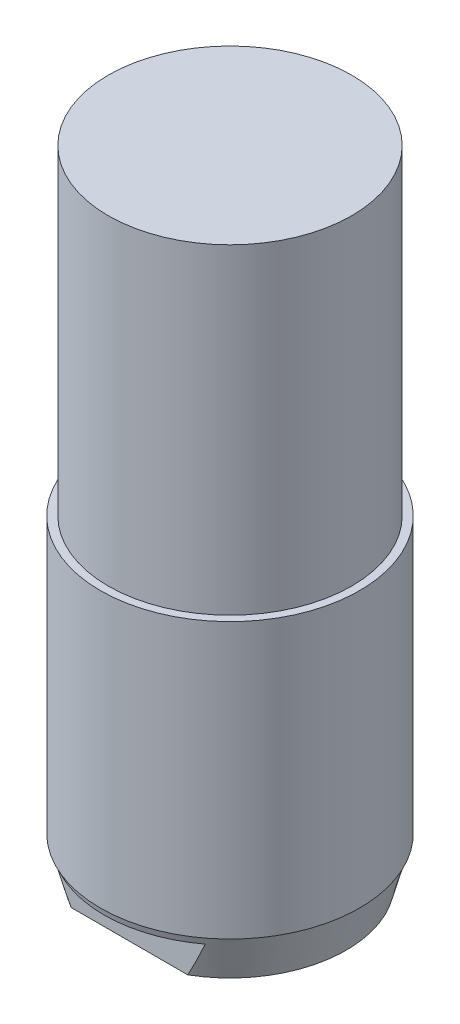
ISO-10303-21;
HEADER;
FILE_DESCRIPTION(('STEP AP214'),'2;1');
FILE_NAME('part.step','',(''),(''),'','','');
FILE_SCHEMA(('AUTOMOTIVE_DESIGN { 1 0 10303 214 1 1 1 1 }'));
ENDSEC;
DATA;
#1=APPLICATION_CONTEXT('core data for automotive mechanical design processes');
#2=APPLICATION_PROTOCOL_DEFINITION('international standard','automotive_design',2000,#1);
#3=PRODUCT_CONTEXT('',#1,'mechanical');
#4=PRODUCT('Part','Part','',(#3));
#5=PRODUCT_RELATED_PRODUCT_CATEGORY('part','',(#4));
#6=PRODUCT_DEFINITION_FORMATION('','',#4);
#7=PRODUCT_DEFINITION_CONTEXT('part definition',#1,'design');
#8=PRODUCT_DEFINITION('design','',#6,#7);
#9=PRODUCT_DEFINITION_SHAPE('','',#8);
#10=(LENGTH_UNIT() NAMED_UNIT(*) SI_UNIT(.MILLI.,.METRE.));
#11=(NAMED_UNIT(*) PLANE_ANGLE_UNIT() SI_UNIT($,.RADIAN.));
#12=(NAMED_UNIT(*) SI_UNIT($,.STERADIAN.) SOLID_ANGLE_UNIT());
#13=UNCERTAINTY_MEASURE_WITH_UNIT(LENGTH_MEASURE(1.E-05),#10,'distance_accuracy_value','');
#14=(GEOMETRIC_REPRESENTATION_CONTEXT(3) GLOBAL_UNCERTAINTY_ASSIGNED_CONTEXT((#13)) GLOBAL_UNIT_ASSIGNED_CONTEXT((#10,
#11,#12)) REPRESENTATION_CONTEXT('',''));
#15=CARTESIAN_POINT('',(0.,0.,0.));
#16=DIRECTION('',(0.,0.,1.));
#17=DIRECTION('',(1.,0.,0.));
#18=AXIS2_PLACEMENT_3D('',#15,#16,#17);
#19=CARTESIAN_POINT('',(0.,1.55,0.));
#20=DIRECTION('',(0.,1.,0.));
#21=DIRECTION('',(0.,0.,1.));
#22=AXIS2_PLACEMENT_3D('',#19,#20,#21);
#23=CYLINDRICAL_SURFACE('',#22,6.5);
#24=CARTESIAN_POINT('',(0.,1.3,0.));
#25=DIRECTION('',(0.,1.,0.));
#26=DIRECTION('',(1.,0.,0.));
#27=AXIS2_PLACEMENT_3D('',#24,#25,#26);
#28=CIRCLE('',#27,6.5);
#29=CARTESIAN_POINT('',(0.,1.3,6.5));
#30=VERTEX_POINT('',#29);
#31=CARTESIAN_POINT('',(0.,1.3,-6.5));
#32=VERTEX_POINT('',#31);
#33=EDGE_CURVE('E212',#30,#32,#28,.T.);
#34=ORIENTED_EDGE('',*,*,#33,.F.);
#35=CARTESIAN_POINT('',(0.,1.3,0.));
#36=DIRECTION('',(0.,1.,0.));
#37=DIRECTION('',(1.,0.,0.));
#38=AXIS2_PLACEMENT_3D('',#35,#36,#37);
#39=CIRCLE('',#38,6.5);
#40=EDGE_CURVE('E238',#32,#30,#39,.T.);
#41=ORIENTED_EDGE('',*,*,#40,.F.);
#42=DIRECTION('',(0.,1.,0.));
#43=VECTOR('',#42,1.);
#44=CARTESIAN_POINT('',(0.,1.55,-6.5));
#45=LINE('',#44,#43);
#46=CARTESIAN_POINT('',(0.,1.8,-6.5));
#47=VERTEX_POINT('',#46);
#48=EDGE_CURVE('E11',#32,#47,#45,.T.);
#49=ORIENTED_EDGE('',*,*,#48,.T.);
#50=CARTESIAN_POINT('',(0.,1.8,0.));
#51=DIRECTION('',(0.,1.,0.));
#52=DIRECTION('',(1.,0.,0.));
#53=AXIS2_PLACEMENT_3D('',#50,#51,#52);
#54=CIRCLE('',#53,6.5);
#55=CARTESIAN_POINT('',(0.,1.8,6.5));
#56=VERTEX_POINT('',#55);
#57=EDGE_CURVE('E184',#47,#56,#54,.T.);
#58=ORIENTED_EDGE('',*,*,#57,.T.);
#59=CARTESIAN_POINT('',(0.,1.8,0.));
#60=DIRECTION('',(0.,1.,0.));
#61=DIRECTION('',(1.,0.,0.));
#62=AXIS2_PLACEMENT_3D('',#59,#60,#61);
#63=CIRCLE('',#62,6.5);
#64=EDGE_CURVE('E177',#56,#47,#63,.T.);
#65=ORIENTED_EDGE('',*,*,#64,.T.);
#66=ORIENTED_EDGE('',*,*,#48,.F.);
#67=EDGE_LOOP('',(#34,#41,#49,#58,#65,#66));
#68=FACE_BOUND('',#67,.T.);
#69=ADVANCED_FACE('F53',(#68),#23,.F.);
#70=CARTESIAN_POINT('',(0.,0.9,0.));
#71=DIRECTION('',(0.,1.,0.));
#72=DIRECTION('',(0.,0.,1.));
#73=AXIS2_PLACEMENT_3D('',#70,#71,#72);
#74=CONICAL_SURFACE('',#73,5.75,0.694738276196703);
#75=ORIENTED_EDGE('',*,*,#64,.F.);
#76=ORIENTED_EDGE('',*,*,#57,.F.);
#77=DIRECTION('',(0.,-0.768221279597376,0.64018439966448));
#78=VECTOR('',#77,1.);
#79=CARTESIAN_POINT('',(0.,0.9,-5.75));
#80=LINE('',#79,#78);
#81=CARTESIAN_POINT('',(0.,0.,-5.));
#82=VERTEX_POINT('',#81);
#83=EDGE_CURVE('E62',#47,#82,#80,.T.);
#84=ORIENTED_EDGE('',*,*,#83,.T.);
#85=CARTESIAN_POINT('',(0.,0.,0.));
#86=DIRECTION('',(0.,1.,0.));
#87=DIRECTION('',(1.,0.,0.));
#88=AXIS2_PLACEMENT_3D('',#85,#86,#87);
#89=CIRCLE('',#88,5.);
#90=CARTESIAN_POINT('',(-5.,0.,0.));
#91=VERTEX_POINT('',#90);
#92=EDGE_CURVE('E234',#82,#91,#89,.T.);
#93=ORIENTED_EDGE('',*,*,#92,.T.);
#94=CARTESIAN_POINT('',(0.,0.,0.));
#95=DIRECTION('',(0.,1.,0.));
#96=DIRECTION('',(1.,0.,0.));
#97=AXIS2_PLACEMENT_3D('',#94,#95,#96);
#98=CIRCLE('',#97,5.);
#99=CARTESIAN_POINT('',(0.,0.,5.));
#100=VERTEX_POINT('',#99);
#101=EDGE_CURVE('E205',#91,#100,#98,.T.);
#102=ORIENTED_EDGE('',*,*,#101,.T.);
#103=CARTESIAN_POINT('',(0.,0.,0.));
#104=DIRECTION('',(0.,1.,0.));
#105=DIRECTION('',(1.,0.,0.));
#106=AXIS2_PLACEMENT_3D('',#103,#104,#105);
#107=CIRCLE('',#106,5.);
#108=EDGE_CURVE('E201',#100,#82,#107,.T.);
#109=ORIENTED_EDGE('',*,*,#108,.T.);
#110=ORIENTED_EDGE('',*,*,#83,.F.);
#111=EDGE_LOOP('',(#75,#76,#84,#93,#102,#109,#110));
#112=FACE_BOUND('',#111,.T.);
#113=ADVANCED_FACE('F411',(#112),#74,.T.);
#114=CARTESIAN_POINT('',(0.,44.3,0.));
#115=DIRECTION('',(0.,1.,0.));
#116=DIRECTION('',(0.,0.,1.));
#117=AXIS2_PLACEMENT_3D('',#114,#115,#116);
#118=CYLINDRICAL_SURFACE('',#117,15.5);
#119=DIRECTION('',(0.,-1.,0.));
#120=VECTOR('',#119,1.);
#121=CARTESIAN_POINT('',(0.,44.3,-15.5));
#122=LINE('',#121,#120);
#123=CARTESIAN_POINT('',(0.,44.5350761789598,-15.5));
#124=VERTEX_POINT('',#123);
#125=CARTESIAN_POINT('',(0.,41.8,-15.5));
#126=VERTEX_POINT('',#125);
#127=EDGE_CURVE('E170',#124,#126,#122,.T.);
#128=ORIENTED_EDGE('',*,*,#127,.F.);
#129=ORIENTED_EDGE('',*,*,#127,.T.);
#130=CARTESIAN_POINT('',(0.,41.8,0.));
#131=DIRECTION('',(0.,1.,0.));
#132=DIRECTION('',(1.,0.,0.));
#133=AXIS2_PLACEMENT_3D('',#130,#131,#132);
#134=CIRCLE('',#133,15.5);
#135=CARTESIAN_POINT('',(0.,41.8,15.5));
#136=VERTEX_POINT('',#135);
#137=EDGE_CURVE('E178',#126,#136,#134,.T.);
#138=ORIENTED_EDGE('',*,*,#137,.T.);
#139=CARTESIAN_POINT('',(0.,41.8,0.));
#140=DIRECTION('',(0.,1.,0.));
#141=DIRECTION('',(1.,0.,0.));
#142=AXIS2_PLACEMENT_3D('',#139,#140,#141);
#143=CIRCLE('',#142,15.5);
#144=EDGE_CURVE('E175',#136,#126,#143,.T.);
#145=ORIENTED_EDGE('',*,*,#144,.T.);
#146=EDGE_LOOP('',(#128,#129,#138,#145));
#147=FACE_BOUND('',#146,.T.);
#148=CARTESIAN_POINT('',(0.,82.6350761789598,0.));
#149=DIRECTION('',(0.,1.,0.));
#150=DIRECTION('',(0.,0.,1.));
#151=AXIS2_PLACEMENT_3D('',#148,#149,#150);
#152=CIRCLE('',#151,15.5);
#153=CARTESIAN_POINT('',(0.,82.6350761789598,15.5));
#154=VERTEX_POINT('',#153);
#155=EDGE_CURVE('E200',#154,#154,#152,.T.);
#156=ORIENTED_EDGE('',*,*,#155,.F.);
#157=EDGE_LOOP('',(#156));
#158=FACE_BOUND('',#157,.T.);
#159=ADVANCED_FACE('F171',(#147,#158),#118,.T.);
#160=CARTESIAN_POINT('',(0.,41.8,15.5));
#161=DIRECTION('',(0.,1.,0.));
#162=DIRECTION('',(1.,0.,0.));
#163=AXIS2_PLACEMENT_3D('',#160,#161,#162);
#164=PLANE('',#163);
#165=ORIENTED_EDGE('',*,*,#144,.F.);
#166=ORIENTED_EDGE('',*,*,#137,.F.);
#167=EDGE_LOOP('',(#165,#166));
#168=FACE_BOUND('',#167,.T.);
#169=CARTESIAN_POINT('',(0.,41.8,0.));
#170=DIRECTION('',(0.,1.,0.));
#171=DIRECTION('',(1.,0.,0.));
#172=AXIS2_PLACEMENT_3D('',#169,#170,#171);
#173=CIRCLE('',#172,16.5);
#174=CARTESIAN_POINT('',(0.,41.8,16.5));
#175=VERTEX_POINT('',#174);
#176=CARTESIAN_POINT('',(0.,41.8,-16.5));
#177=VERTEX_POINT('',#176);
#178=EDGE_CURVE('E223',#175,#177,#173,.T.);
#179=ORIENTED_EDGE('',*,*,#178,.T.);
#180=CARTESIAN_POINT('',(0.,41.8,0.));
#181=DIRECTION('',(0.,1.,0.));
#182=DIRECTION('',(1.,0.,0.));
#183=AXIS2_PLACEMENT_3D('',#180,#181,#182);
#184=CIRCLE('',#183,16.5);
#185=EDGE_CURVE('E311',#177,#175,#184,.T.);
#186=ORIENTED_EDGE('',*,*,#185,.T.);
#187=EDGE_LOOP('',(#179,#186));
#188=FACE_BOUND('',#187,.T.);
#189=ADVANCED_FACE('F410',(#168,#188),#164,.T.);
#190=CARTESIAN_POINT('',(0.,24.3,0.));
#191=DIRECTION('',(0.,1.,0.));
#192=DIRECTION('',(0.,0.,1.));
#193=AXIS2_PLACEMENT_3D('',#190,#191,#192);
#194=CYLINDRICAL_SURFACE('',#193,16.5);
#195=ORIENTED_EDGE('',*,*,#178,.F.);
#196=ORIENTED_EDGE('',*,*,#185,.F.);
#197=DIRECTION('',(0.,-1.,0.));
#198=VECTOR('',#197,1.);
#199=CARTESIAN_POINT('',(0.,24.3,-16.5));
#200=LINE('',#199,#198);
#201=CARTESIAN_POINT('',(0.,6.8,-16.5));
#202=VERTEX_POINT('',#201);
#203=EDGE_CURVE('E314',#177,#202,#200,.T.);
#204=ORIENTED_EDGE('',*,*,#203,.T.);
#205=CARTESIAN_POINT('',(0.,6.8,0.));
#206=DIRECTION('',(0.,1.,0.));
#207=DIRECTION('',(1.,0.,0.));
#208=AXIS2_PLACEMENT_3D('',#205,#206,#207);
#209=CIRCLE('',#208,16.5);
#210=CARTESIAN_POINT('',(0.,6.8,16.5));
#211=VERTEX_POINT('',#210);
#212=EDGE_CURVE('E220',#202,#211,#209,.T.);
#213=ORIENTED_EDGE('',*,*,#212,.T.);
#214=CARTESIAN_POINT('',(0.,6.8,0.));
#215=DIRECTION('',(0.,1.,0.));
#216=DIRECTION('',(1.,0.,0.));
#217=AXIS2_PLACEMENT_3D('',#214,#215,#216);
#218=CIRCLE('',#217,16.5);
#219=EDGE_CURVE('E224',#211,#202,#218,.T.);
#220=ORIENTED_EDGE('',*,*,#219,.T.);
#221=ORIENTED_EDGE('',*,*,#203,.F.);
#222=EDGE_LOOP('',(#195,#196,#204,#213,#220,#221));
#223=FACE_BOUND('',#222,.T.);
#224=ADVANCED_FACE('F418',(#223),#194,.T.);
#225=CARTESIAN_POINT('',(0.,6.8,16.5));
#226=DIRECTION('',(0.,-1.,0.));
#227=DIRECTION('',(0.,0.,-1.));
#228=AXIS2_PLACEMENT_3D('',#225,#226,#227);
#229=PLANE('',#228);
#230=CARTESIAN_POINT('',(0.,6.8,0.));
#231=DIRECTION('',(0.,1.,0.));
#232=DIRECTION('',(1.,0.,0.));
#233=AXIS2_PLACEMENT_3D('',#230,#231,#232);
#234=CIRCLE('',#233,16.3);
#235=CARTESIAN_POINT('',(0.,6.8,16.3));
#236=VERTEX_POINT('',#235);
#237=CARTESIAN_POINT('',(0.,6.8,-16.3));
#238=VERTEX_POINT('',#237);
#239=EDGE_CURVE('E276',#236,#238,#234,.T.);
#240=ORIENTED_EDGE('',*,*,#239,.T.);
#241=CARTESIAN_POINT('',(0.,6.8,0.));
#242=DIRECTION('',(0.,1.,0.));
#243=DIRECTION('',(1.,0.,0.));
#244=AXIS2_PLACEMENT_3D('',#241,#242,#243);
#245=CIRCLE('',#244,16.3);
#246=EDGE_CURVE('E283',#238,#236,#245,.T.);
#247=ORIENTED_EDGE('',*,*,#246,.T.);
#248=EDGE_LOOP('',(#240,#247));
#249=FACE_BOUND('',#248,.T.);
#250=ORIENTED_EDGE('',*,*,#219,.F.);
#251=ORIENTED_EDGE('',*,*,#212,.F.);
#252=EDGE_LOOP('',(#250,#251));
#253=FACE_BOUND('',#252,.T.);
#254=ADVANCED_FACE('F432',(#249,#253),#229,.T.);
#255=CARTESIAN_POINT('',(0.,1.3,14.8));
#256=DIRECTION('',(0.,-1.,0.));
#257=DIRECTION('',(0.,0.,-1.));
#258=AXIS2_PLACEMENT_3D('',#255,#256,#257);
#259=PLANE('',#258);
#260=ORIENTED_EDGE('',*,*,#33,.T.);
#261=ORIENTED_EDGE('',*,*,#40,.T.);
#262=EDGE_LOOP('',(#260,#261));
#263=FACE_BOUND('',#262,.T.);
#264=DIRECTION('',(1.,0.,0.));
#265=VECTOR('',#264,1.);
#266=CARTESIAN_POINT('',(11.7126219535445,1.3,-12.8));
#267=LINE('',#266,#265);
#268=CARTESIAN_POINT('',(-7.42967024840269,1.3,-12.8));
#269=VERTEX_POINT('',#268);
#270=CARTESIAN_POINT('',(7.42967024840269,1.3,-12.8));
#271=VERTEX_POINT('',#270);
#272=EDGE_CURVE('E252',#269,#271,#267,.T.);
#273=ORIENTED_EDGE('',*,*,#272,.T.);
#274=CARTESIAN_POINT('',(0.,1.3,0.));
#275=DIRECTION('',(0.,1.,0.));
#276=DIRECTION('',(1.,0.,0.));
#277=AXIS2_PLACEMENT_3D('',#274,#275,#276);
#278=CIRCLE('',#277,14.8);
#279=CARTESIAN_POINT('',(7.42967024840268,1.3,12.8));
#280=VERTEX_POINT('',#279);
#281=EDGE_CURVE('E266',#280,#271,#278,.T.);
#282=ORIENTED_EDGE('',*,*,#281,.F.);
#283=DIRECTION('',(-1.,0.,0.));
#284=VECTOR('',#283,1.);
#285=CARTESIAN_POINT('',(11.7126219535445,1.3,12.8));
#286=LINE('',#285,#284);
#287=CARTESIAN_POINT('',(-7.42967024840268,1.3,12.8));
#288=VERTEX_POINT('',#287);
#289=EDGE_CURVE('E209',#280,#288,#286,.T.);
#290=ORIENTED_EDGE('',*,*,#289,.T.);
#291=CARTESIAN_POINT('',(0.,1.3,0.));
#292=DIRECTION('',(0.,1.,0.));
#293=DIRECTION('',(1.,0.,0.));
#294=AXIS2_PLACEMENT_3D('',#291,#292,#293);
#295=CIRCLE('',#294,14.8);
#296=EDGE_CURVE('E225',#269,#288,#295,.T.);
#297=ORIENTED_EDGE('',*,*,#296,.F.);
#298=EDGE_LOOP('',(#273,#282,#290,#297));
#299=FACE_BOUND('',#298,.T.);
#300=ADVANCED_FACE('F428',(#263,#299),#259,.T.);
#301=CARTESIAN_POINT('',(23.4252439070891,1.3,12.8));
#302=DIRECTION('',(0.,0.,-1.));
#303=DIRECTION('',(0.,-1.,0.));
#304=AXIS2_PLACEMENT_3D('',#301,#302,#303);
#305=PLANE('',#304);
#306=CARTESIAN_POINT('',(-7.42967024840269,1.3,12.8));
#307=CARTESIAN_POINT('',(-8.493422900236,3.25803256123512,12.8));
#308=CARTESIAN_POINT('',(-9.64538599924234,5.8,12.8));
#309=(BOUNDED_CURVE() B_SPLINE_CURVE(2,(#306,#307,#308),.UNSPECIFIED.,.F.,
.F.) B_SPLINE_CURVE_WITH_KNOTS((3,3),(0.,0.501671560482377),
.UNSPECIFIED.) CURVE() GEOMETRIC_REPRESENTATION_ITEM() RATIONAL_B_SPLINE_CURVE((1.,
1.00259307196518,1.)) REPRESENTATION_ITEM(''));
#310=CARTESIAN_POINT('',(-9.64538599924234,5.8,12.8));
#311=VERTEX_POINT('',#310);
#312=EDGE_CURVE('E229',#288,#311,#309,.T.);
#313=ORIENTED_EDGE('',*,*,#312,.F.);
#314=ORIENTED_EDGE('',*,*,#289,.F.);
#315=CARTESIAN_POINT('',(9.64538599924234,5.8,12.8));
#316=CARTESIAN_POINT('',(8.493422900236,3.25803256123512,12.8));
#317=CARTESIAN_POINT('',(7.42967024840269,1.3,12.8));
#318=(BOUNDED_CURVE() B_SPLINE_CURVE(2,(#315,#316,#317),.UNSPECIFIED.,.F.,
.F.) B_SPLINE_CURVE_WITH_KNOTS((3,3),(0.,0.501671560482377),
.UNSPECIFIED.) CURVE() GEOMETRIC_REPRESENTATION_ITEM() RATIONAL_B_SPLINE_CURVE((1.,
1.00259307196518,1.)) REPRESENTATION_ITEM(''));
#319=CARTESIAN_POINT('',(9.64538599924234,5.8,12.8));
#320=VERTEX_POINT('',#319);
#321=EDGE_CURVE('E260',#320,#280,#318,.T.);
#322=ORIENTED_EDGE('',*,*,#321,.F.);
#323=DIRECTION('',(-1.,0.,0.));
#324=VECTOR('',#323,1.);
#325=CARTESIAN_POINT('',(23.4252439070891,5.8,12.8));
#326=LINE('',#325,#324);
#327=EDGE_CURVE('E213',#320,#311,#326,.T.);
#328=ORIENTED_EDGE('',*,*,#327,.T.);
#329=EDGE_LOOP('',(#313,#314,#322,#328));
#330=FACE_BOUND('',#329,.T.);
#331=ADVANCED_FACE('F431',(#330),#305,.F.);
#332=CARTESIAN_POINT('',(-1.24584614945535,5.8,16.8013352733042));
#333=DIRECTION('',(0.,1.,0.));
#334=DIRECTION('',(1.,0.,0.));
#335=AXIS2_PLACEMENT_3D('',#332,#333,#334);
#336=PLANE('',#335);
#337=CARTESIAN_POINT('',(0.,5.8,0.));
#338=DIRECTION('',(0.,1.,0.));
#339=DIRECTION('',(0.,0.,1.));
#340=AXIS2_PLACEMENT_3D('',#337,#338,#339);
#341=CIRCLE('',#340,16.0272727272727);
#342=EDGE_CURVE('E267',#311,#320,#341,.T.);
#343=ORIENTED_EDGE('',*,*,#342,.F.);
#344=ORIENTED_EDGE('',*,*,#327,.F.);
#345=EDGE_LOOP('',(#343,#344));
#346=FACE_BOUND('',#345,.T.);
#347=ADVANCED_FACE('F467',(#346),#336,.F.);
#348=CARTESIAN_POINT('',(0.,4.05,0.));
#349=DIRECTION('',(0.,1.,0.));
#350=DIRECTION('',(0.,0.,1.));
#351=AXIS2_PLACEMENT_3D('',#348,#349,#350);
#352=CONICAL_SURFACE('',#351,15.55,0.266252049150925);
#353=ORIENTED_EDGE('',*,*,#239,.F.);
#354=ORIENTED_EDGE('',*,*,#246,.F.);
#355=DIRECTION('',(0.,-0.964763821237732,0.263117405792108));
#356=VECTOR('',#355,1.);
#357=CARTESIAN_POINT('',(0.,4.05,-15.55));
#358=LINE('',#357,#356);
#359=CARTESIAN_POINT('',(0.,5.8,-16.0272727272727));
#360=VERTEX_POINT('',#359);
#361=EDGE_CURVE('E230',#238,#360,#358,.T.);
#362=ORIENTED_EDGE('',*,*,#361,.T.);
#363=CARTESIAN_POINT('',(0.,5.8,0.));
#364=DIRECTION('',(0.,1.,0.));
#365=DIRECTION('',(0.,0.,1.));
#366=AXIS2_PLACEMENT_3D('',#363,#364,#365);
#367=CIRCLE('',#366,16.0272727272727);
#368=CARTESIAN_POINT('',(-9.64538599924234,5.8,-12.8));
#369=VERTEX_POINT('',#368);
#370=EDGE_CURVE('E214',#360,#369,#367,.T.);
#371=ORIENTED_EDGE('',*,*,#370,.T.);
#372=CARTESIAN_POINT('',(-9.64538599924234,5.8,-12.8));
#373=CARTESIAN_POINT('',(-8.493422900236,3.25803256123512,-12.8));
#374=CARTESIAN_POINT('',(-7.42967024840269,1.3,-12.8));
#375=(BOUNDED_CURVE() B_SPLINE_CURVE(2,(#372,#373,#374),.UNSPECIFIED.,.F.,
.F.) B_SPLINE_CURVE_WITH_KNOTS((3,3),(0.,0.501671560482377),
.UNSPECIFIED.) CURVE() GEOMETRIC_REPRESENTATION_ITEM() RATIONAL_B_SPLINE_CURVE((1.,
1.00259307196518,1.)) REPRESENTATION_ITEM(''));
#376=EDGE_CURVE('E259',#369,#269,#375,.T.);
#377=ORIENTED_EDGE('',*,*,#376,.T.);
#378=ORIENTED_EDGE('',*,*,#296,.T.);
#379=ORIENTED_EDGE('',*,*,#312,.T.);
#380=ORIENTED_EDGE('',*,*,#342,.T.);
#381=ORIENTED_EDGE('',*,*,#321,.T.);
#382=ORIENTED_EDGE('',*,*,#281,.T.);
#383=CARTESIAN_POINT('',(7.42967024840269,1.3,-12.8));
#384=CARTESIAN_POINT('',(8.493422900236,3.25803256123512,-12.8));
#385=CARTESIAN_POINT('',(9.64538599924234,5.8,-12.8));
#386=(BOUNDED_CURVE() B_SPLINE_CURVE(2,(#383,#384,#385),.UNSPECIFIED.,.F.,
.F.) B_SPLINE_CURVE_WITH_KNOTS((3,3),(0.,0.501671560482377),
.UNSPECIFIED.) CURVE() GEOMETRIC_REPRESENTATION_ITEM() RATIONAL_B_SPLINE_CURVE((1.,
1.00259307196518,1.)) REPRESENTATION_ITEM(''));
#387=CARTESIAN_POINT('',(9.64538599924234,5.8,-12.8));
#388=VERTEX_POINT('',#387);
#389=EDGE_CURVE('E218',#271,#388,#386,.T.);
#390=ORIENTED_EDGE('',*,*,#389,.T.);
#391=CARTESIAN_POINT('',(0.,5.8,0.));
#392=DIRECTION('',(0.,1.,0.));
#393=DIRECTION('',(0.,0.,1.));
#394=AXIS2_PLACEMENT_3D('',#391,#392,#393);
#395=CIRCLE('',#394,16.0272727272727);
#396=EDGE_CURVE('E241',#388,#360,#395,.T.);
#397=ORIENTED_EDGE('',*,*,#396,.T.);
#398=ORIENTED_EDGE('',*,*,#361,.F.);
#399=EDGE_LOOP('',(#353,#354,#362,#371,#377,#378,#379,#380,#381,#382,#390,#397,#398));
#400=FACE_BOUND('',#399,.T.);
#401=ADVANCED_FACE('F443',(#400),#352,.T.);
#402=CARTESIAN_POINT('',(23.4252439070891,1.3,-12.8));
#403=DIRECTION('',(0.,0.,-1.));
#404=DIRECTION('',(0.,-1.,0.));
#405=AXIS2_PLACEMENT_3D('',#402,#403,#404);
#406=PLANE('',#405);
#407=ORIENTED_EDGE('',*,*,#389,.F.);
#408=ORIENTED_EDGE('',*,*,#272,.F.);
#409=ORIENTED_EDGE('',*,*,#376,.F.);
#410=DIRECTION('',(-1.,0.,0.));
#411=VECTOR('',#410,1.);
#412=CARTESIAN_POINT('',(23.4252439070891,5.8,-12.8));
#413=LINE('',#412,#411);
#414=EDGE_CURVE('E219',#388,#369,#413,.T.);
#415=ORIENTED_EDGE('',*,*,#414,.F.);
#416=EDGE_LOOP('',(#407,#408,#409,#415));
#417=FACE_BOUND('',#416,.T.);
#418=ADVANCED_FACE('F439',(#417),#406,.T.);
#419=CARTESIAN_POINT('',(-1.24584614945535,5.8,-16.8013352733042));
#420=DIRECTION('',(0.,-1.,0.));
#421=DIRECTION('',(0.,0.,-1.));
#422=AXIS2_PLACEMENT_3D('',#419,#420,#421);
#423=PLANE('',#422);
#424=ORIENTED_EDGE('',*,*,#396,.F.);
#425=ORIENTED_EDGE('',*,*,#414,.T.);
#426=ORIENTED_EDGE('',*,*,#370,.F.);
#427=EDGE_LOOP('',(#424,#425,#426));
#428=FACE_BOUND('',#427,.T.);
#429=ADVANCED_FACE('F451',(#428),#423,.T.);
#430=CARTESIAN_POINT('',(0.,0.,0.));
#431=DIRECTION('',(0.,1.,0.));
#432=DIRECTION('',(1.,0.,0.));
#433=AXIS2_PLACEMENT_3D('',#430,#431,#432);
#434=CYLINDRICAL_SURFACE('',#433,5.);
#435=DIRECTION('',(0.,1.,0.));
#436=VECTOR('',#435,1.);
#437=CARTESIAN_POINT('',(-5.,0.,0.));
#438=LINE('',#437,#436);
#439=CARTESIAN_POINT('',(-5.,44.5350761789598,0.));
#440=VERTEX_POINT('',#439);
#441=EDGE_CURVE('E208',#91,#440,#438,.T.);
#442=ORIENTED_EDGE('',*,*,#441,.T.);
#443=CARTESIAN_POINT('',(0.,44.5350761789598,0.));
#444=DIRECTION('',(0.,-1.,0.));
#445=DIRECTION('',(0.,0.,-1.));
#446=AXIS2_PLACEMENT_3D('',#443,#444,#445);
#447=CIRCLE('',#446,5.);
#448=EDGE_CURVE('E56',#440,#440,#447,.F.);
#449=ORIENTED_EDGE('',*,*,#448,.T.);
#450=ORIENTED_EDGE('',*,*,#441,.F.);
#451=ORIENTED_EDGE('',*,*,#92,.F.);
#452=ORIENTED_EDGE('',*,*,#108,.F.);
#453=ORIENTED_EDGE('',*,*,#101,.F.);
#454=EDGE_LOOP('',(#442,#449,#450,#451,#452,#453));
#455=FACE_BOUND('',#454,.T.);
#456=ADVANCED_FACE('F453',(#455),#434,.F.);
#457=CARTESIAN_POINT('',(0.,44.5350761789598,0.));
#458=DIRECTION('',(0.,1.,0.));
#459=DIRECTION('',(0.,0.,1.));
#460=AXIS2_PLACEMENT_3D('',#457,#458,#459);
#461=PLANE('',#460);
#462=ORIENTED_EDGE('',*,*,#448,.F.);
#463=EDGE_LOOP('',(#462));
#464=FACE_BOUND('',#463,.T.);
#465=ADVANCED_FACE('F460',(#464),#461,.F.);
#466=CARTESIAN_POINT('',(0.,82.6350761789598,0.));
#467=DIRECTION('',(0.,1.,0.));
#468=DIRECTION('',(0.,0.,1.));
#469=AXIS2_PLACEMENT_3D('',#466,#467,#468);
#470=PLANE('',#469);
#471=ORIENTED_EDGE('',*,*,#155,.T.);
#472=EDGE_LOOP('',(#471));
#473=FACE_BOUND('',#472,.T.);
#474=ADVANCED_FACE('F408',(#473),#470,.T.);
#475=CLOSED_SHELL('',(#69,#113,#159,#189,#224,#254,#300,#331,#347,#401,#418,#429,#456,#465,#474));
#476=MANIFOLD_SOLID_BREP('B2',#475);
#477=ADVANCED_BREP_SHAPE_REPRESENTATION('',(#18,#476),#14);
#478=SHAPE_DEFINITION_REPRESENTATION(#9,#477);
ENDSEC;
END-ISO-10303-21;
